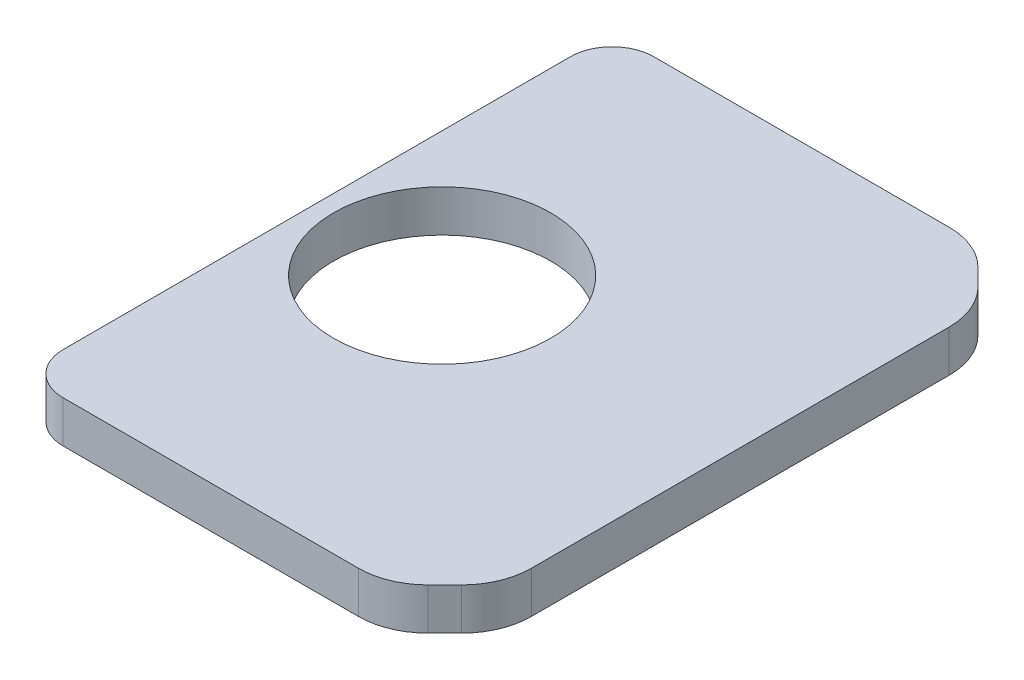
ISO-10303-21;
HEADER;
FILE_DESCRIPTION(('STEP AP214'),'2;1');
FILE_NAME('part.step','',(''),(''),'','','');
FILE_SCHEMA(('AUTOMOTIVE_DESIGN { 1 0 10303 214 1 1 1 1 }'));
ENDSEC;
DATA;
#1=APPLICATION_CONTEXT('core data for automotive mechanical design processes');
#2=APPLICATION_PROTOCOL_DEFINITION('international standard','automotive_design',2000,#1);
#3=PRODUCT_CONTEXT('',#1,'mechanical');
#4=PRODUCT('Part','Part','',(#3));
#5=PRODUCT_RELATED_PRODUCT_CATEGORY('part','',(#4));
#6=PRODUCT_DEFINITION_FORMATION('','',#4);
#7=PRODUCT_DEFINITION_CONTEXT('part definition',#1,'design');
#8=PRODUCT_DEFINITION('design','',#6,#7);
#9=PRODUCT_DEFINITION_SHAPE('','',#8);
#10=(LENGTH_UNIT() NAMED_UNIT(*) SI_UNIT(.MILLI.,.METRE.));
#11=(NAMED_UNIT(*) PLANE_ANGLE_UNIT() SI_UNIT($,.RADIAN.));
#12=(NAMED_UNIT(*) SI_UNIT($,.STERADIAN.) SOLID_ANGLE_UNIT());
#13=UNCERTAINTY_MEASURE_WITH_UNIT(LENGTH_MEASURE(1.E-05),#10,'distance_accuracy_value','');
#14=(GEOMETRIC_REPRESENTATION_CONTEXT(3) GLOBAL_UNCERTAINTY_ASSIGNED_CONTEXT((#13)) GLOBAL_UNIT_ASSIGNED_CONTEXT((#10,
#11,#12)) REPRESENTATION_CONTEXT('',''));
#15=CARTESIAN_POINT('',(0.,0.,0.));
#16=DIRECTION('',(0.,0.,1.));
#17=DIRECTION('',(1.,0.,0.));
#18=AXIS2_PLACEMENT_3D('',#15,#16,#17);
#19=CARTESIAN_POINT('',(-45.0520268312707,3.,0.103882928526616));
#20=DIRECTION('',(0.,-1.,0.));
#21=DIRECTION('',(0.,0.,-1.));
#22=AXIS2_PLACEMENT_3D('',#19,#20,#21);
#23=CYLINDRICAL_SURFACE('',#22,1.65000000000054);
#24=CARTESIAN_POINT('',(-45.0520268312707,0.,0.103882928526616));
#25=DIRECTION('',(0.,-1.,0.));
#26=DIRECTION('',(0.,0.,1.));
#27=AXIS2_PLACEMENT_3D('',#24,#25,#26);
#28=CIRCLE('',#27,1.65000000000054);
#29=CARTESIAN_POINT('',(-45.0520268312707,0.,1.75388292852716));
#30=VERTEX_POINT('',#29);
#31=EDGE_CURVE('E482',#30,#30,#28,.T.);
#32=ORIENTED_EDGE('',*,*,#31,.T.);
#33=EDGE_LOOP('',(#32));
#34=FACE_BOUND('',#33,.T.);
#35=CARTESIAN_POINT('',(-45.0520268312707,2.8,0.103882928526616));
#36=DIRECTION('',(0.,1.,0.));
#37=DIRECTION('',(0.,0.,1.));
#38=AXIS2_PLACEMENT_3D('',#35,#36,#37);
#39=CIRCLE('',#38,1.65000000000054);
#40=CARTESIAN_POINT('',(-45.0520268312707,2.8,1.75388292852716));
#41=VERTEX_POINT('',#40);
#42=EDGE_CURVE('E11',#41,#41,#39,.F.);
#43=ORIENTED_EDGE('',*,*,#42,.F.);
#44=EDGE_LOOP('',(#43));
#45=FACE_BOUND('',#44,.T.);
#46=ADVANCED_FACE('F34',(#34,#45),#23,.F.);
#47=CARTESIAN_POINT('',(-24.9427666577715,3.,0.103882928565224));
#48=DIRECTION('',(0.,-1.,0.));
#49=DIRECTION('',(0.,0.,-1.));
#50=AXIS2_PLACEMENT_3D('',#47,#48,#49);
#51=CYLINDRICAL_SURFACE('',#50,1.65000000000026);
#52=CARTESIAN_POINT('',(-24.9427666577715,0.,0.103882928565224));
#53=DIRECTION('',(0.,1.,0.));
#54=DIRECTION('',(0.,0.,1.));
#55=AXIS2_PLACEMENT_3D('',#52,#53,#54);
#56=CIRCLE('',#55,1.65000000000026);
#57=CARTESIAN_POINT('',(-24.9427666577715,0.,1.75388292856549));
#58=VERTEX_POINT('',#57);
#59=EDGE_CURVE('E162',#58,#58,#56,.T.);
#60=ORIENTED_EDGE('',*,*,#59,.F.);
#61=EDGE_LOOP('',(#60));
#62=FACE_BOUND('',#61,.T.);
#63=CARTESIAN_POINT('',(-24.9427666577715,2.8,0.103882928565224));
#64=DIRECTION('',(0.,1.,0.));
#65=DIRECTION('',(0.,0.,1.));
#66=AXIS2_PLACEMENT_3D('',#63,#64,#65);
#67=CIRCLE('',#66,1.65000000000026);
#68=CARTESIAN_POINT('',(-24.9427666577715,2.8,1.75388292856549));
#69=VERTEX_POINT('',#68);
#70=EDGE_CURVE('E515',#69,#69,#67,.T.);
#71=ORIENTED_EDGE('',*,*,#70,.T.);
#72=EDGE_LOOP('',(#71));
#73=FACE_BOUND('',#72,.T.);
#74=ADVANCED_FACE('F234',(#62,#73),#51,.F.);
#75=CARTESIAN_POINT('',(-24.9427666577713,3.,-30.8961170714348));
#76=DIRECTION('',(0.,-1.,0.));
#77=DIRECTION('',(0.,0.,-1.));
#78=AXIS2_PLACEMENT_3D('',#75,#76,#77);
#79=CYLINDRICAL_SURFACE('',#78,1.65000000000026);
#80=CARTESIAN_POINT('',(-24.9427666577713,0.,-30.8961170714348));
#81=DIRECTION('',(0.,1.,0.));
#82=DIRECTION('',(0.,0.,1.));
#83=AXIS2_PLACEMENT_3D('',#80,#81,#82);
#84=CIRCLE('',#83,1.65000000000026);
#85=CARTESIAN_POINT('',(-24.9427666577713,0.,-29.2461170714345));
#86=VERTEX_POINT('',#85);
#87=EDGE_CURVE('E157',#86,#86,#84,.T.);
#88=ORIENTED_EDGE('',*,*,#87,.F.);
#89=EDGE_LOOP('',(#88));
#90=FACE_BOUND('',#89,.T.);
#91=CARTESIAN_POINT('',(-24.9427666577713,2.8,-30.8961170714348));
#92=DIRECTION('',(0.,1.,0.));
#93=DIRECTION('',(0.,0.,1.));
#94=AXIS2_PLACEMENT_3D('',#91,#92,#93);
#95=CIRCLE('',#94,1.65000000000026);
#96=CARTESIAN_POINT('',(-24.9427666577713,2.8,-29.2461170714345));
#97=VERTEX_POINT('',#96);
#98=EDGE_CURVE('E512',#97,#97,#95,.T.);
#99=ORIENTED_EDGE('',*,*,#98,.T.);
#100=EDGE_LOOP('',(#99));
#101=FACE_BOUND('',#100,.T.);
#102=ADVANCED_FACE('F225',(#90,#101),#79,.F.);
#103=CARTESIAN_POINT('',(-45.0520268312707,3.,-30.8961170714734));
#104=DIRECTION('',(0.,-1.,0.));
#105=DIRECTION('',(0.,0.,-1.));
#106=AXIS2_PLACEMENT_3D('',#103,#104,#105);
#107=CYLINDRICAL_SURFACE('',#106,1.65000000000054);
#108=CARTESIAN_POINT('',(-45.0520268312707,0.,-30.8961170714734));
#109=DIRECTION('',(0.,-1.,0.));
#110=DIRECTION('',(0.,0.,1.));
#111=AXIS2_PLACEMENT_3D('',#108,#109,#110);
#112=CIRCLE('',#111,1.65000000000054);
#113=CARTESIAN_POINT('',(-45.0520268312707,0.,-29.2461170714729));
#114=VERTEX_POINT('',#113);
#115=EDGE_CURVE('E479',#114,#114,#112,.T.);
#116=ORIENTED_EDGE('',*,*,#115,.T.);
#117=EDGE_LOOP('',(#116));
#118=FACE_BOUND('',#117,.T.);
#119=CARTESIAN_POINT('',(-45.0520268312707,2.8,-30.8961170714734));
#120=DIRECTION('',(0.,1.,0.));
#121=DIRECTION('',(0.,0.,1.));
#122=AXIS2_PLACEMENT_3D('',#119,#120,#121);
#123=CIRCLE('',#122,1.65000000000054);
#124=CARTESIAN_POINT('',(-45.0520268312707,2.8,-29.2461170714729));
#125=VERTEX_POINT('',#124);
#126=EDGE_CURVE('E42',#125,#125,#123,.F.);
#127=ORIENTED_EDGE('',*,*,#126,.F.);
#128=EDGE_LOOP('',(#127));
#129=FACE_BOUND('',#128,.T.);
#130=ADVANCED_FACE('F223',(#118,#129),#107,.F.);
#131=CARTESIAN_POINT('',(-8.08284112074566E-13,3.,-36.5961170714357));
#132=DIRECTION('',(0.,0.,1.));
#133=DIRECTION('',(1.,0.,0.));
#134=AXIS2_PLACEMENT_3D('',#131,#132,#133);
#135=PLANE('',#134);
#136=DIRECTION('',(-1.,0.,0.));
#137=VECTOR('',#136,1.);
#138=CARTESIAN_POINT('',(-8.08284112074566E-13,0.,-36.5961170714357));
#139=LINE('',#138,#137);
#140=CARTESIAN_POINT('',(-25.247225573089,0.,-36.5961170714352));
#141=VERTEX_POINT('',#140);
#142=CARTESIAN_POINT('',(-46.442766657779,0.,-36.5961170714347));
#143=VERTEX_POINT('',#142);
#144=EDGE_CURVE('E145',#141,#143,#139,.T.);
#145=ORIENTED_EDGE('',*,*,#144,.T.);
#146=DIRECTION('',(0.,1.,0.));
#147=VECTOR('',#146,1.);
#148=CARTESIAN_POINT('',(-46.442766657779,3.,-36.5961170714347));
#149=LINE('',#148,#147);
#150=CARTESIAN_POINT('',(-46.442766657779,3.,-36.5961170714347));
#151=VERTEX_POINT('',#150);
#152=EDGE_CURVE('E205',#143,#151,#149,.T.);
#153=ORIENTED_EDGE('',*,*,#152,.T.);
#154=DIRECTION('',(-1.,0.,0.));
#155=VECTOR('',#154,1.);
#156=CARTESIAN_POINT('',(-8.08284112074566E-13,3.,-36.5961170714357));
#157=LINE('',#156,#155);
#158=CARTESIAN_POINT('',(-25.247225573089,3.,-36.5961170714352));
#159=VERTEX_POINT('',#158);
#160=EDGE_CURVE('E148',#159,#151,#157,.T.);
#161=ORIENTED_EDGE('',*,*,#160,.F.);
#162=DIRECTION('',(0.,-1.,0.));
#163=VECTOR('',#162,1.);
#164=CARTESIAN_POINT('',(-25.247225573089,0.,-36.5961170714352));
#165=LINE('',#164,#163);
#166=EDGE_CURVE('E131',#159,#141,#165,.T.);
#167=ORIENTED_EDGE('',*,*,#166,.T.);
#168=EDGE_LOOP('',(#145,#153,#161,#167));
#169=FACE_BOUND('',#168,.T.);
#170=ADVANCED_FACE('F143',(#169),#135,.F.);
#171=CARTESIAN_POINT('',(0.,3.,5.80388292856506));
#172=DIRECTION('',(0.,0.,1.));
#173=DIRECTION('',(1.,0.,0.));
#174=AXIS2_PLACEMENT_3D('',#171,#172,#173);
#175=PLANE('',#174);
#176=DIRECTION('',(-1.,0.,0.));
#177=VECTOR('',#176,1.);
#178=CARTESIAN_POINT('',(0.,3.,5.80388292856506));
#179=LINE('',#178,#177);
#180=CARTESIAN_POINT('',(-25.2472255730887,3.,5.80388292856506));
#181=VERTEX_POINT('',#180);
#182=CARTESIAN_POINT('',(-46.4427666577804,3.,5.80388292856506));
#183=VERTEX_POINT('',#182);
#184=EDGE_CURVE('E469',#181,#183,#179,.T.);
#185=ORIENTED_EDGE('',*,*,#184,.T.);
#186=DIRECTION('',(0.,1.,0.));
#187=VECTOR('',#186,1.);
#188=CARTESIAN_POINT('',(-46.4427666577804,0.,5.80388292856506));
#189=LINE('',#188,#187);
#190=CARTESIAN_POINT('',(-46.4427666577804,0.,5.80388292856506));
#191=VERTEX_POINT('',#190);
#192=EDGE_CURVE('E49',#183,#191,#189,.F.);
#193=ORIENTED_EDGE('',*,*,#192,.T.);
#194=DIRECTION('',(-1.,0.,0.));
#195=VECTOR('',#194,1.);
#196=CARTESIAN_POINT('',(0.,0.,5.80388292856506));
#197=LINE('',#196,#195);
#198=CARTESIAN_POINT('',(-25.2472255730887,0.,5.80388292856506));
#199=VERTEX_POINT('',#198);
#200=EDGE_CURVE('E156',#199,#191,#197,.T.);
#201=ORIENTED_EDGE('',*,*,#200,.F.);
#202=DIRECTION('',(0.,-1.,0.));
#203=VECTOR('',#202,1.);
#204=CARTESIAN_POINT('',(-25.2472255730887,3.,5.80388292856506));
#205=LINE('',#204,#203);
#206=EDGE_CURVE('E201',#199,#181,#205,.F.);
#207=ORIENTED_EDGE('',*,*,#206,.T.);
#208=EDGE_LOOP('',(#185,#193,#201,#207));
#209=FACE_BOUND('',#208,.T.);
#210=ADVANCED_FACE('F232',(#209),#175,.T.);
#211=CARTESIAN_POINT('',(-8.68613741632906,3.,-8.68613741632906));
#212=DIRECTION('',(-0.707106781186547,0.,-0.707106781186547));
#213=DIRECTION('',(-0.707106781186548,0.,0.707106781186548));
#214=AXIS2_PLACEMENT_3D('',#211,#212,#213);
#215=PLANE('',#214);
#216=DIRECTION('',(0.707106781186548,0.,-0.707106781186548));
#217=VECTOR('',#216,1.);
#218=CARTESIAN_POINT('',(-8.68613741632906,0.,-8.68613741632906));
#219=LINE('',#218,#217);
#220=CARTESIAN_POINT('',(-21.7116916671559,0.,4.3394168344978));
#221=VERTEX_POINT('',#220);
#222=CARTESIAN_POINT('',(-20.5072327518374,0.,3.13495791917924));
#223=VERTEX_POINT('',#222);
#224=EDGE_CURVE('E159',#221,#223,#219,.T.);
#225=ORIENTED_EDGE('',*,*,#224,.T.);
#226=DIRECTION('',(0.,-1.,0.));
#227=VECTOR('',#226,1.);
#228=CARTESIAN_POINT('',(-20.5072327518374,3.,3.13495791917923));
#229=LINE('',#228,#227);
#230=CARTESIAN_POINT('',(-20.5072327518374,3.,3.13495791917924));
#231=VERTEX_POINT('',#230);
#232=EDGE_CURVE('E199',#223,#231,#229,.F.);
#233=ORIENTED_EDGE('',*,*,#232,.T.);
#234=DIRECTION('',(0.707106781186548,0.,-0.707106781186548));
#235=VECTOR('',#234,1.);
#236=CARTESIAN_POINT('',(-8.68613741632906,3.,-8.68613741632906));
#237=LINE('',#236,#235);
#238=CARTESIAN_POINT('',(-21.7116916671559,3.,4.3394168344978));
#239=VERTEX_POINT('',#238);
#240=EDGE_CURVE('E472',#239,#231,#237,.T.);
#241=ORIENTED_EDGE('',*,*,#240,.F.);
#242=DIRECTION('',(0.,-1.,0.));
#243=VECTOR('',#242,1.);
#244=CARTESIAN_POINT('',(-21.7116916671559,0.,4.3394168344978));
#245=LINE('',#244,#243);
#246=EDGE_CURVE('E196',#239,#221,#245,.T.);
#247=ORIENTED_EDGE('',*,*,#246,.T.);
#248=EDGE_LOOP('',(#225,#233,#241,#247));
#249=FACE_BOUND('',#248,.T.);
#250=ADVANCED_FACE('F368',(#249),#215,.F.);
#251=CARTESIAN_POINT('',(-19.0427666577701,3.,0.));
#252=DIRECTION('',(-1.,0.,0.));
#253=DIRECTION('',(0.,0.,1.));
#254=AXIS2_PLACEMENT_3D('',#251,#252,#253);
#255=PLANE('',#254);
#256=DIRECTION('',(0.,0.,-1.));
#257=VECTOR('',#256,1.);
#258=CARTESIAN_POINT('',(-19.0427666577701,0.,0.));
#259=LINE('',#258,#257);
#260=CARTESIAN_POINT('',(-19.0427666577701,0.,-0.400575986753501));
#261=VERTEX_POINT('',#260);
#262=CARTESIAN_POINT('',(-19.0427666577701,0.,-30.3916581561163));
#263=VERTEX_POINT('',#262);
#264=EDGE_CURVE('E168',#261,#263,#259,.T.);
#265=ORIENTED_EDGE('',*,*,#264,.T.);
#266=DIRECTION('',(0.,-1.,0.));
#267=VECTOR('',#266,1.);
#268=CARTESIAN_POINT('',(-19.0427666577701,3.,-30.3916581561163));
#269=LINE('',#268,#267);
#270=CARTESIAN_POINT('',(-19.0427666577701,3.,-30.3916581561163));
#271=VERTEX_POINT('',#270);
#272=EDGE_CURVE('E194',#263,#271,#269,.F.);
#273=ORIENTED_EDGE('',*,*,#272,.T.);
#274=DIRECTION('',(0.,0.,-1.));
#275=VECTOR('',#274,1.);
#276=CARTESIAN_POINT('',(-19.0427666577701,3.,0.));
#277=LINE('',#276,#275);
#278=CARTESIAN_POINT('',(-19.0427666577701,3.,-0.400575986753501));
#279=VERTEX_POINT('',#278);
#280=EDGE_CURVE('E489',#279,#271,#277,.T.);
#281=ORIENTED_EDGE('',*,*,#280,.F.);
#282=DIRECTION('',(0.,-1.,0.));
#283=VECTOR('',#282,1.);
#284=CARTESIAN_POINT('',(-19.0427666577701,3.,-0.400575986753501));
#285=LINE('',#284,#283);
#286=EDGE_CURVE('E191',#279,#261,#285,.T.);
#287=ORIENTED_EDGE('',*,*,#286,.T.);
#288=EDGE_LOOP('',(#265,#273,#281,#287));
#289=FACE_BOUND('',#288,.T.);
#290=ADVANCED_FACE('F360',(#289),#255,.F.);
#291=CARTESIAN_POINT('',(6.70997965510587,3.,-6.70997965510587));
#292=DIRECTION('',(0.707106781186547,0.,-0.707106781186547));
#293=DIRECTION('',(-0.707106781186548,0.,-0.707106781186548));
#294=AXIS2_PLACEMENT_3D('',#291,#292,#293);
#295=PLANE('',#294);
#296=DIRECTION('',(0.707106781186548,0.,0.707106781186548));
#297=VECTOR('',#296,1.);
#298=CARTESIAN_POINT('',(6.70997965510587,0.,-6.70997965510587));
#299=LINE('',#298,#297);
#300=CARTESIAN_POINT('',(-21.7116916671562,0.,-35.1316509773679));
#301=VERTEX_POINT('',#300);
#302=CARTESIAN_POINT('',(-20.5072327518374,0.,-33.9271920620491));
#303=VERTEX_POINT('',#302);
#304=EDGE_CURVE('E171',#301,#303,#299,.T.);
#305=ORIENTED_EDGE('',*,*,#304,.F.);
#306=DIRECTION('',(0.,-1.,0.));
#307=VECTOR('',#306,1.);
#308=CARTESIAN_POINT('',(-21.7116916671562,3.,-35.1316509773679));
#309=LINE('',#308,#307);
#310=CARTESIAN_POINT('',(-21.7116916671562,3.,-35.1316509773679));
#311=VERTEX_POINT('',#310);
#312=EDGE_CURVE('E132',#301,#311,#309,.F.);
#313=ORIENTED_EDGE('',*,*,#312,.T.);
#314=DIRECTION('',(0.707106781186548,0.,0.707106781186548));
#315=VECTOR('',#314,1.);
#316=CARTESIAN_POINT('',(6.70997965510587,3.,-6.70997965510587));
#317=LINE('',#316,#315);
#318=CARTESIAN_POINT('',(-20.5072327518374,3.,-33.9271920620491));
#319=VERTEX_POINT('',#318);
#320=EDGE_CURVE('E492',#311,#319,#317,.T.);
#321=ORIENTED_EDGE('',*,*,#320,.T.);
#322=DIRECTION('',(0.,-1.,0.));
#323=VECTOR('',#322,1.);
#324=CARTESIAN_POINT('',(-20.5072327518374,0.,-33.9271920620491));
#325=LINE('',#324,#323);
#326=EDGE_CURVE('E137',#319,#303,#325,.T.);
#327=ORIENTED_EDGE('',*,*,#326,.T.);
#328=EDGE_LOOP('',(#305,#313,#321,#327));
#329=FACE_BOUND('',#328,.T.);
#330=ADVANCED_FACE('F352',(#329),#295,.T.);
#331=CARTESIAN_POINT('',(-40.4427666577536,3.,-15.3961170714399));
#332=DIRECTION('',(0.,-1.,0.));
#333=DIRECTION('',(0.,0.,-1.));
#334=AXIS2_PLACEMENT_3D('',#331,#332,#333);
#335=CYLINDRICAL_SURFACE('',#334,7.79888748869771);
#336=CARTESIAN_POINT('',(-40.4427666577536,3.,-15.3961170714399));
#337=DIRECTION('',(0.,1.,0.));
#338=DIRECTION('',(0.,0.,1.));
#339=AXIS2_PLACEMENT_3D('',#336,#337,#338);
#340=CIRCLE('',#339,7.79888748869771);
#341=CARTESIAN_POINT('',(-40.4427666577536,3.,-7.59722958274218));
#342=VERTEX_POINT('',#341);
#343=EDGE_CURVE('E150',#342,#342,#340,.T.);
#344=ORIENTED_EDGE('',*,*,#343,.T.);
#345=EDGE_LOOP('',(#344));
#346=FACE_BOUND('',#345,.T.);
#347=CARTESIAN_POINT('',(-40.4427666577536,0.,-15.3961170714399));
#348=DIRECTION('',(0.,1.,0.));
#349=DIRECTION('',(0.,0.,1.));
#350=AXIS2_PLACEMENT_3D('',#347,#348,#349);
#351=CIRCLE('',#350,7.79888748869771);
#352=CARTESIAN_POINT('',(-40.4427666577536,0.,-7.59722958274218));
#353=VERTEX_POINT('',#352);
#354=EDGE_CURVE('E173',#353,#353,#351,.T.);
#355=ORIENTED_EDGE('',*,*,#354,.F.);
#356=EDGE_LOOP('',(#355));
#357=FACE_BOUND('',#356,.T.);
#358=ADVANCED_FACE('F344',(#346,#357),#335,.F.);
#359=CARTESIAN_POINT('',(0.,3.,0.));
#360=DIRECTION('',(0.,1.,0.));
#361=DIRECTION('',(0.,0.,1.));
#362=AXIS2_PLACEMENT_3D('',#359,#360,#361);
#363=PLANE('',#362);
#364=ORIENTED_EDGE('',*,*,#160,.T.);
#365=CARTESIAN_POINT('',(-46.442766657779,3.,-33.5961170714347));
#366=DIRECTION('',(0.,1.,0.));
#367=DIRECTION('',(0.,0.,1.));
#368=AXIS2_PLACEMENT_3D('',#365,#366,#367);
#369=CIRCLE('',#368,3.);
#370=CARTESIAN_POINT('',(-49.442766657779,3.,-33.5961170714348));
#371=VERTEX_POINT('',#370);
#372=EDGE_CURVE('E209',#151,#371,#369,.T.);
#373=ORIENTED_EDGE('',*,*,#372,.T.);
#374=DIRECTION('',(0.,0.,1.));
#375=VECTOR('',#374,1.);
#376=CARTESIAN_POINT('',(-49.4427666577806,3.,8.07231038836346));
#377=LINE('',#376,#375);
#378=CARTESIAN_POINT('',(-49.4427666577804,3.,2.80388292856495));
#379=VERTEX_POINT('',#378);
#380=EDGE_CURVE('E477',#371,#379,#377,.T.);
#381=ORIENTED_EDGE('',*,*,#380,.T.);
#382=CARTESIAN_POINT('',(-46.4427666577804,3.,2.80388292856506));
#383=DIRECTION('',(0.,1.,0.));
#384=DIRECTION('',(0.,0.,1.));
#385=AXIS2_PLACEMENT_3D('',#382,#383,#384);
#386=CIRCLE('',#385,3.);
#387=EDGE_CURVE('E207',#379,#183,#386,.T.);
#388=ORIENTED_EDGE('',*,*,#387,.T.);
#389=ORIENTED_EDGE('',*,*,#184,.F.);
#390=CARTESIAN_POINT('',(-25.2472255730887,3.,0.803882928565062));
#391=DIRECTION('',(0.,1.,0.));
#392=DIRECTION('',(0.,0.,1.));
#393=AXIS2_PLACEMENT_3D('',#390,#391,#392);
#394=CIRCLE('',#393,5.);
#395=EDGE_CURVE('E183',#181,#239,#394,.T.);
#396=ORIENTED_EDGE('',*,*,#395,.T.);
#397=ORIENTED_EDGE('',*,*,#240,.T.);
#398=CARTESIAN_POINT('',(-24.0427666577701,3.,-0.400575986753501));
#399=DIRECTION('',(0.,1.,0.));
#400=DIRECTION('',(0.,0.,1.));
#401=AXIS2_PLACEMENT_3D('',#398,#399,#400);
#402=CIRCLE('',#401,5.);
#403=EDGE_CURVE('E185',#231,#279,#402,.T.);
#404=ORIENTED_EDGE('',*,*,#403,.T.);
#405=ORIENTED_EDGE('',*,*,#280,.T.);
#406=CARTESIAN_POINT('',(-24.0427666577701,3.,-30.3916581561163));
#407=DIRECTION('',(0.,1.,0.));
#408=DIRECTION('',(0.,0.,1.));
#409=AXIS2_PLACEMENT_3D('',#406,#407,#408);
#410=CIRCLE('',#409,5.);
#411=EDGE_CURVE('E187',#271,#319,#410,.T.);
#412=ORIENTED_EDGE('',*,*,#411,.T.);
#413=ORIENTED_EDGE('',*,*,#320,.F.);
#414=CARTESIAN_POINT('',(-25.2472255730889,3.,-31.5961170714352));
#415=DIRECTION('',(0.,1.,0.));
#416=DIRECTION('',(0.,0.,1.));
#417=AXIS2_PLACEMENT_3D('',#414,#415,#416);
#418=CIRCLE('',#417,5.);
#419=EDGE_CURVE('E189',#311,#159,#418,.T.);
#420=ORIENTED_EDGE('',*,*,#419,.T.);
#421=EDGE_LOOP('',(#364,#373,#381,#388,#389,#396,#397,#404,#405,#412,#413,#420));
#422=FACE_BOUND('',#421,.T.);
#423=ORIENTED_EDGE('',*,*,#343,.F.);
#424=EDGE_LOOP('',(#423));
#425=FACE_BOUND('',#424,.T.);
#426=ADVANCED_FACE('F337',(#422,#425),#363,.T.);
#427=CARTESIAN_POINT('',(0.,0.,0.));
#428=DIRECTION('',(0.,1.,0.));
#429=DIRECTION('',(0.,0.,1.));
#430=AXIS2_PLACEMENT_3D('',#427,#428,#429);
#431=PLANE('',#430);
#432=ORIENTED_EDGE('',*,*,#31,.F.);
#433=EDGE_LOOP('',(#432));
#434=FACE_BOUND('',#433,.T.);
#435=ORIENTED_EDGE('',*,*,#115,.F.);
#436=EDGE_LOOP('',(#435));
#437=FACE_BOUND('',#436,.T.);
#438=ORIENTED_EDGE('',*,*,#59,.T.);
#439=EDGE_LOOP('',(#438));
#440=FACE_BOUND('',#439,.T.);
#441=ORIENTED_EDGE('',*,*,#87,.T.);
#442=EDGE_LOOP('',(#441));
#443=FACE_BOUND('',#442,.T.);
#444=DIRECTION('',(0.,0.,-1.));
#445=VECTOR('',#444,1.);
#446=CARTESIAN_POINT('',(-49.4427666577802,0.,-1.90043217239209E-12));
#447=LINE('',#446,#445);
#448=CARTESIAN_POINT('',(-49.4427666577804,0.,2.80388292856495));
#449=VERTEX_POINT('',#448);
#450=CARTESIAN_POINT('',(-49.442766657779,0.,-33.5961170714348));
#451=VERTEX_POINT('',#450);
#452=EDGE_CURVE('E203',#449,#451,#447,.T.);
#453=ORIENTED_EDGE('',*,*,#452,.T.);
#454=CARTESIAN_POINT('',(-46.442766657779,0.,-33.5961170714347));
#455=DIRECTION('',(0.,1.,0.));
#456=DIRECTION('',(0.,0.,1.));
#457=AXIS2_PLACEMENT_3D('',#454,#455,#456);
#458=CIRCLE('',#457,3.);
#459=EDGE_CURVE('E155',#451,#143,#458,.F.);
#460=ORIENTED_EDGE('',*,*,#459,.T.);
#461=ORIENTED_EDGE('',*,*,#144,.F.);
#462=CARTESIAN_POINT('',(-25.2472255730889,0.,-31.5961170714352));
#463=DIRECTION('',(0.,1.,0.));
#464=DIRECTION('',(0.,0.,1.));
#465=AXIS2_PLACEMENT_3D('',#462,#463,#464);
#466=CIRCLE('',#465,5.);
#467=EDGE_CURVE('E127',#141,#301,#466,.F.);
#468=ORIENTED_EDGE('',*,*,#467,.T.);
#469=ORIENTED_EDGE('',*,*,#304,.T.);
#470=CARTESIAN_POINT('',(-24.0427666577701,0.,-30.3916581561163));
#471=DIRECTION('',(0.,1.,0.));
#472=DIRECTION('',(0.,0.,1.));
#473=AXIS2_PLACEMENT_3D('',#470,#471,#472);
#474=CIRCLE('',#473,5.);
#475=EDGE_CURVE('E138',#303,#263,#474,.F.);
#476=ORIENTED_EDGE('',*,*,#475,.T.);
#477=ORIENTED_EDGE('',*,*,#264,.F.);
#478=CARTESIAN_POINT('',(-24.0427666577701,0.,-0.400575986753501));
#479=DIRECTION('',(0.,1.,0.));
#480=DIRECTION('',(0.,0.,1.));
#481=AXIS2_PLACEMENT_3D('',#478,#479,#480);
#482=CIRCLE('',#481,5.);
#483=EDGE_CURVE('E177',#261,#223,#482,.F.);
#484=ORIENTED_EDGE('',*,*,#483,.T.);
#485=ORIENTED_EDGE('',*,*,#224,.F.);
#486=CARTESIAN_POINT('',(-25.2472255730887,0.,0.803882928565062));
#487=DIRECTION('',(0.,1.,0.));
#488=DIRECTION('',(0.,0.,1.));
#489=AXIS2_PLACEMENT_3D('',#486,#487,#488);
#490=CIRCLE('',#489,5.);
#491=EDGE_CURVE('E149',#221,#199,#490,.F.);
#492=ORIENTED_EDGE('',*,*,#491,.T.);
#493=ORIENTED_EDGE('',*,*,#200,.T.);
#494=CARTESIAN_POINT('',(-46.4427666577804,0.,2.80388292856506));
#495=DIRECTION('',(0.,1.,0.));
#496=DIRECTION('',(0.,0.,1.));
#497=AXIS2_PLACEMENT_3D('',#494,#495,#496);
#498=CIRCLE('',#497,3.);
#499=EDGE_CURVE('E215',#191,#449,#498,.F.);
#500=ORIENTED_EDGE('',*,*,#499,.T.);
#501=EDGE_LOOP('',(#453,#460,#461,#468,#469,#476,#477,#484,#485,#492,#493,#500));
#502=FACE_BOUND('',#501,.T.);
#503=ORIENTED_EDGE('',*,*,#354,.T.);
#504=EDGE_LOOP('',(#503));
#505=FACE_BOUND('',#504,.T.);
#506=ADVANCED_FACE('F152',(#434,#437,#440,#443,#502,#505),#431,.F.);
#507=CARTESIAN_POINT('',(-25.2472255730889,3.,-31.5961170714352));
#508=DIRECTION('',(0.,1.,0.));
#509=DIRECTION('',(0.,0.,1.));
#510=AXIS2_PLACEMENT_3D('',#507,#508,#509);
#511=CYLINDRICAL_SURFACE('',#510,5.);
#512=ORIENTED_EDGE('',*,*,#419,.F.);
#513=ORIENTED_EDGE('',*,*,#312,.F.);
#514=ORIENTED_EDGE('',*,*,#467,.F.);
#515=ORIENTED_EDGE('',*,*,#166,.F.);
#516=EDGE_LOOP('',(#512,#513,#514,#515));
#517=FACE_BOUND('',#516,.T.);
#518=ADVANCED_FACE('F130',(#517),#511,.T.);
#519=CARTESIAN_POINT('',(-24.0427666577701,3.,-30.3916581561163));
#520=DIRECTION('',(0.,1.,0.));
#521=DIRECTION('',(0.,0.,1.));
#522=AXIS2_PLACEMENT_3D('',#519,#520,#521);
#523=CYLINDRICAL_SURFACE('',#522,5.);
#524=ORIENTED_EDGE('',*,*,#411,.F.);
#525=ORIENTED_EDGE('',*,*,#272,.F.);
#526=ORIENTED_EDGE('',*,*,#475,.F.);
#527=ORIENTED_EDGE('',*,*,#326,.F.);
#528=EDGE_LOOP('',(#524,#525,#526,#527));
#529=FACE_BOUND('',#528,.T.);
#530=ADVANCED_FACE('F316',(#529),#523,.T.);
#531=CARTESIAN_POINT('',(-24.0427666577701,3.,-0.400575986753501));
#532=DIRECTION('',(0.,-1.,0.));
#533=DIRECTION('',(0.,0.,-1.));
#534=AXIS2_PLACEMENT_3D('',#531,#532,#533);
#535=CYLINDRICAL_SURFACE('',#534,5.);
#536=ORIENTED_EDGE('',*,*,#403,.F.);
#537=ORIENTED_EDGE('',*,*,#232,.F.);
#538=ORIENTED_EDGE('',*,*,#483,.F.);
#539=ORIENTED_EDGE('',*,*,#286,.F.);
#540=EDGE_LOOP('',(#536,#537,#538,#539));
#541=FACE_BOUND('',#540,.T.);
#542=ADVANCED_FACE('F307',(#541),#535,.T.);
#543=CARTESIAN_POINT('',(-25.2472255730887,3.,0.803882928565062));
#544=DIRECTION('',(0.,1.,0.));
#545=DIRECTION('',(0.,0.,1.));
#546=AXIS2_PLACEMENT_3D('',#543,#544,#545);
#547=CYLINDRICAL_SURFACE('',#546,5.);
#548=ORIENTED_EDGE('',*,*,#395,.F.);
#549=ORIENTED_EDGE('',*,*,#206,.F.);
#550=ORIENTED_EDGE('',*,*,#491,.F.);
#551=ORIENTED_EDGE('',*,*,#246,.F.);
#552=EDGE_LOOP('',(#548,#549,#550,#551));
#553=FACE_BOUND('',#552,.T.);
#554=ADVANCED_FACE('F300',(#553),#547,.T.);
#555=CARTESIAN_POINT('',(-49.4427666577806,3.,8.07231038836346));
#556=DIRECTION('',(1.,0.,0.));
#557=DIRECTION('',(0.,0.,-1.));
#558=AXIS2_PLACEMENT_3D('',#555,#556,#557);
#559=PLANE('',#558);
#560=ORIENTED_EDGE('',*,*,#380,.F.);
#561=DIRECTION('',(0.,1.,0.));
#562=VECTOR('',#561,1.);
#563=CARTESIAN_POINT('',(-49.442766657779,3.,-33.5961170714348));
#564=LINE('',#563,#562);
#565=EDGE_CURVE('E57',#371,#451,#564,.F.);
#566=ORIENTED_EDGE('',*,*,#565,.T.);
#567=ORIENTED_EDGE('',*,*,#452,.F.);
#568=DIRECTION('',(0.,1.,0.));
#569=VECTOR('',#568,1.);
#570=CARTESIAN_POINT('',(-49.4427666577804,3.,2.80388292856495));
#571=LINE('',#570,#569);
#572=EDGE_CURVE('E211',#449,#379,#571,.T.);
#573=ORIENTED_EDGE('',*,*,#572,.T.);
#574=EDGE_LOOP('',(#560,#566,#567,#573));
#575=FACE_BOUND('',#574,.T.);
#576=ADVANCED_FACE('F293',(#575),#559,.F.);
#577=CARTESIAN_POINT('',(-46.442766657779,3.,-33.5961170714347));
#578=DIRECTION('',(0.,1.,0.));
#579=DIRECTION('',(0.,0.,1.));
#580=AXIS2_PLACEMENT_3D('',#577,#578,#579);
#581=CYLINDRICAL_SURFACE('',#580,3.);
#582=ORIENTED_EDGE('',*,*,#459,.F.);
#583=ORIENTED_EDGE('',*,*,#565,.F.);
#584=ORIENTED_EDGE('',*,*,#372,.F.);
#585=ORIENTED_EDGE('',*,*,#152,.F.);
#586=EDGE_LOOP('',(#582,#583,#584,#585));
#587=FACE_BOUND('',#586,.T.);
#588=ADVANCED_FACE('F285',(#587),#581,.T.);
#589=CARTESIAN_POINT('',(-46.4427666577804,3.,2.80388292856506));
#590=DIRECTION('',(0.,-1.,0.));
#591=DIRECTION('',(0.,0.,-1.));
#592=AXIS2_PLACEMENT_3D('',#589,#590,#591);
#593=CYLINDRICAL_SURFACE('',#592,3.);
#594=ORIENTED_EDGE('',*,*,#499,.F.);
#595=ORIENTED_EDGE('',*,*,#192,.F.);
#596=ORIENTED_EDGE('',*,*,#387,.F.);
#597=ORIENTED_EDGE('',*,*,#572,.F.);
#598=EDGE_LOOP('',(#594,#595,#596,#597));
#599=FACE_BOUND('',#598,.T.);
#600=ADVANCED_FACE('F36',(#599),#593,.T.);
#601=CARTESIAN_POINT('',(-45.0520268312707,2.8,-30.8961170714734));
#602=DIRECTION('',(0.,1.,0.));
#603=DIRECTION('',(0.,0.,1.));
#604=AXIS2_PLACEMENT_3D('',#601,#602,#603);
#605=PLANE('',#604);
#606=ORIENTED_EDGE('',*,*,#126,.T.);
#607=EDGE_LOOP('',(#606));
#608=FACE_BOUND('',#607,.T.);
#609=ADVANCED_FACE('F221',(#608),#605,.F.);
#610=CARTESIAN_POINT('',(-24.9427666577713,2.8,-30.8961170714348));
#611=DIRECTION('',(0.,1.,0.));
#612=DIRECTION('',(0.,0.,1.));
#613=AXIS2_PLACEMENT_3D('',#610,#611,#612);
#614=PLANE('',#613);
#615=ORIENTED_EDGE('',*,*,#98,.F.);
#616=EDGE_LOOP('',(#615));
#617=FACE_BOUND('',#616,.T.);
#618=ADVANCED_FACE('F252',(#617),#614,.F.);
#619=CARTESIAN_POINT('',(-24.9427666577715,2.8,0.103882928565224));
#620=DIRECTION('',(0.,1.,0.));
#621=DIRECTION('',(0.,0.,1.));
#622=AXIS2_PLACEMENT_3D('',#619,#620,#621);
#623=PLANE('',#622);
#624=ORIENTED_EDGE('',*,*,#70,.F.);
#625=EDGE_LOOP('',(#624));
#626=FACE_BOUND('',#625,.T.);
#627=ADVANCED_FACE('F255',(#626),#623,.F.);
#628=CARTESIAN_POINT('',(-45.0520268312707,2.8,0.103882928526616));
#629=DIRECTION('',(0.,1.,0.));
#630=DIRECTION('',(0.,0.,1.));
#631=AXIS2_PLACEMENT_3D('',#628,#629,#630);
#632=PLANE('',#631);
#633=ORIENTED_EDGE('',*,*,#42,.T.);
#634=EDGE_LOOP('',(#633));
#635=FACE_BOUND('',#634,.T.);
#636=ADVANCED_FACE('F259',(#635),#632,.F.);
#637=CLOSED_SHELL('',(#46,#74,#102,#130,#170,#210,#250,#290,#330,#358,#426,#506,#518,#530,#542,
#554,#576,#588,#600,#609,#618,#627,#636));
#638=MANIFOLD_SOLID_BREP('B2',#637);
#639=ADVANCED_BREP_SHAPE_REPRESENTATION('',(#18,#638),#14);
#640=SHAPE_DEFINITION_REPRESENTATION(#9,#639);
ENDSEC;
END-ISO-10303-21;
